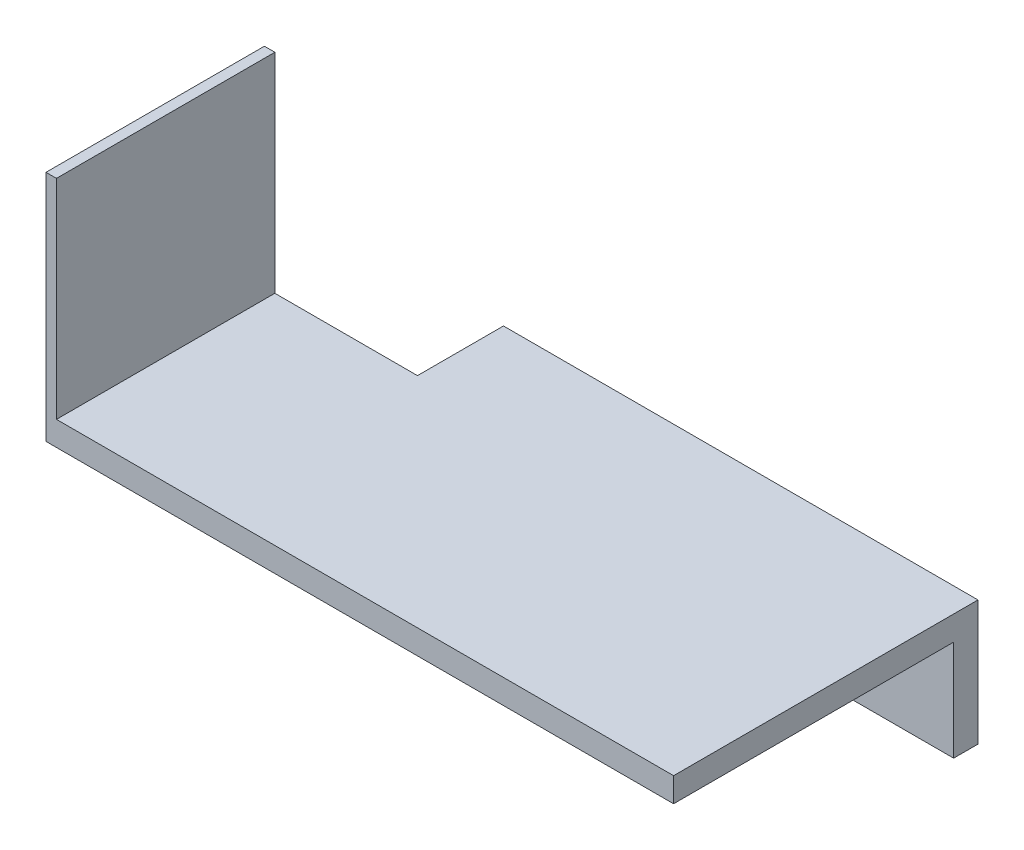
ISO-10303-21;
HEADER;
FILE_DESCRIPTION(('STEP AP214'),'2;1');
FILE_NAME('part.step','',(''),(''),'','','');
FILE_SCHEMA(('AUTOMOTIVE_DESIGN { 1 0 10303 214 1 1 1 1 }'));
ENDSEC;
DATA;
#1=APPLICATION_CONTEXT('core data for automotive mechanical design processes');
#2=APPLICATION_PROTOCOL_DEFINITION('international standard','automotive_design',2000,#1);
#3=PRODUCT_CONTEXT('',#1,'mechanical');
#4=PRODUCT('Part','Part','',(#3));
#5=PRODUCT_RELATED_PRODUCT_CATEGORY('part','',(#4));
#6=PRODUCT_DEFINITION_FORMATION('','',#4);
#7=PRODUCT_DEFINITION_CONTEXT('part definition',#1,'design');
#8=PRODUCT_DEFINITION('design','',#6,#7);
#9=PRODUCT_DEFINITION_SHAPE('','',#8);
#10=(LENGTH_UNIT() NAMED_UNIT(*) SI_UNIT(.MILLI.,.METRE.));
#11=(NAMED_UNIT(*) PLANE_ANGLE_UNIT() SI_UNIT($,.RADIAN.));
#12=(NAMED_UNIT(*) SI_UNIT($,.STERADIAN.) SOLID_ANGLE_UNIT());
#13=UNCERTAINTY_MEASURE_WITH_UNIT(LENGTH_MEASURE(1.E-05),#10,'distance_accuracy_value','');
#14=(GEOMETRIC_REPRESENTATION_CONTEXT(3) GLOBAL_UNCERTAINTY_ASSIGNED_CONTEXT((#13)) GLOBAL_UNIT_ASSIGNED_CONTEXT((#10,
#11,#12)) REPRESENTATION_CONTEXT('',''));
#15=CARTESIAN_POINT('',(0.,0.,0.));
#16=DIRECTION('',(0.,0.,1.));
#17=DIRECTION('',(1.,0.,0.));
#18=AXIS2_PLACEMENT_3D('',#15,#16,#17);
#19=CARTESIAN_POINT('',(34.1,8.975,3.5));
#20=DIRECTION('',(0.,-1.,0.));
#21=DIRECTION('',(0.,0.,-1.));
#22=AXIS2_PLACEMENT_3D('',#19,#20,#21);
#23=PLANE('',#22);
#24=DIRECTION('',(0.,0.,-1.));
#25=VECTOR('',#24,1.);
#26=CARTESIAN_POINT('',(-54.5965302079105,8.975,12.3613736549553));
#27=LINE('',#26,#25);
#28=CARTESIAN_POINT('',(-54.5965302079105,8.975,43.75));
#29=VERTEX_POINT('',#28);
#30=CARTESIAN_POINT('',(-54.5965302079105,8.975,12.3613736549553));
#31=VERTEX_POINT('',#30);
#32=EDGE_CURVE('E50',#29,#31,#27,.T.);
#33=ORIENTED_EDGE('',*,*,#32,.F.);
#34=DIRECTION('',(-1.,0.,0.));
#35=VECTOR('',#34,1.);
#36=CARTESIAN_POINT('',(34.1,8.975,43.75));
#37=LINE('',#36,#35);
#38=CARTESIAN_POINT('',(34.1,8.975,43.75));
#39=VERTEX_POINT('',#38);
#40=EDGE_CURVE('E158',#39,#29,#37,.T.);
#41=ORIENTED_EDGE('',*,*,#40,.F.);
#42=DIRECTION('',(0.,0.,-1.));
#43=VECTOR('',#42,1.);
#44=CARTESIAN_POINT('',(34.1,8.975,3.5));
#45=LINE('',#44,#43);
#46=CARTESIAN_POINT('',(34.1,8.975,0.));
#47=VERTEX_POINT('',#46);
#48=EDGE_CURVE('E194',#39,#47,#45,.T.);
#49=ORIENTED_EDGE('',*,*,#48,.T.);
#50=DIRECTION('',(-1.,0.,0.));
#51=VECTOR('',#50,1.);
#52=CARTESIAN_POINT('',(34.1,8.975,0.));
#53=LINE('',#52,#51);
#54=CARTESIAN_POINT('',(-34.1,8.975,0.));
#55=VERTEX_POINT('',#54);
#56=EDGE_CURVE('E180',#47,#55,#53,.T.);
#57=ORIENTED_EDGE('',*,*,#56,.T.);
#58=DIRECTION('',(0.,0.,-1.));
#59=VECTOR('',#58,1.);
#60=CARTESIAN_POINT('',(-34.1,8.975,3.5));
#61=LINE('',#60,#59);
#62=CARTESIAN_POINT('',(-34.1,8.975,12.3613736549553));
#63=VERTEX_POINT('',#62);
#64=EDGE_CURVE('E184',#63,#55,#61,.T.);
#65=ORIENTED_EDGE('',*,*,#64,.F.);
#66=DIRECTION('',(1.,0.,0.));
#67=VECTOR('',#66,1.);
#68=CARTESIAN_POINT('',(-56.1,8.975,12.3613736549553));
#69=LINE('',#68,#67);
#70=EDGE_CURVE('E57',#31,#63,#69,.T.);
#71=ORIENTED_EDGE('',*,*,#70,.F.);
#72=EDGE_LOOP('',(#33,#41,#49,#57,#65,#71));
#73=FACE_BOUND('',#72,.T.);
#74=ADVANCED_FACE('F35',(#73),#23,.F.);
#75=CARTESIAN_POINT('',(-34.1,-8.975,3.5));
#76=DIRECTION('',(1.,0.,0.));
#77=DIRECTION('',(0.,0.,-1.));
#78=AXIS2_PLACEMENT_3D('',#75,#76,#77);
#79=PLANE('',#78);
#80=DIRECTION('',(0.,-1.,0.));
#81=VECTOR('',#80,1.);
#82=CARTESIAN_POINT('',(-34.1,5.475,12.3613736549553));
#83=LINE('',#82,#81);
#84=CARTESIAN_POINT('',(-34.1,5.475,12.3613736549553));
#85=VERTEX_POINT('',#84);
#86=EDGE_CURVE('E147',#63,#85,#83,.T.);
#87=ORIENTED_EDGE('',*,*,#86,.F.);
#88=ORIENTED_EDGE('',*,*,#64,.T.);
#89=DIRECTION('',(0.,-1.,0.));
#90=VECTOR('',#89,1.);
#91=CARTESIAN_POINT('',(-34.1,-8.975,0.));
#92=LINE('',#91,#90);
#93=CARTESIAN_POINT('',(-34.1,-8.975,0.));
#94=VERTEX_POINT('',#93);
#95=EDGE_CURVE('E176',#55,#94,#92,.T.);
#96=ORIENTED_EDGE('',*,*,#95,.T.);
#97=DIRECTION('',(0.,0.,-1.));
#98=VECTOR('',#97,1.);
#99=CARTESIAN_POINT('',(-34.1,-8.975,3.5));
#100=LINE('',#99,#98);
#101=CARTESIAN_POINT('',(-34.1,-8.975,3.5));
#102=VERTEX_POINT('',#101);
#103=EDGE_CURVE('E11',#102,#94,#100,.T.);
#104=ORIENTED_EDGE('',*,*,#103,.F.);
#105=DIRECTION('',(0.,-1.,0.));
#106=VECTOR('',#105,1.);
#107=CARTESIAN_POINT('',(-34.1,-8.975,3.5));
#108=LINE('',#107,#106);
#109=CARTESIAN_POINT('',(-34.1,5.475,3.5));
#110=VERTEX_POINT('',#109);
#111=EDGE_CURVE('E177',#110,#102,#108,.T.);
#112=ORIENTED_EDGE('',*,*,#111,.F.);
#113=DIRECTION('',(0.,0.,-1.));
#114=VECTOR('',#113,1.);
#115=CARTESIAN_POINT('',(-34.1,5.475,31.75));
#116=LINE('',#115,#114);
#117=EDGE_CURVE('E174',#85,#110,#116,.T.);
#118=ORIENTED_EDGE('',*,*,#117,.F.);
#119=EDGE_LOOP('',(#87,#88,#96,#104,#112,#118));
#120=FACE_BOUND('',#119,.T.);
#121=ADVANCED_FACE('F37',(#120),#79,.F.);
#122=CARTESIAN_POINT('',(34.1,-8.975,3.5));
#123=DIRECTION('',(0.,1.,0.));
#124=DIRECTION('',(0.,0.,1.));
#125=AXIS2_PLACEMENT_3D('',#122,#123,#124);
#126=PLANE('',#125);
#127=DIRECTION('',(1.,0.,0.));
#128=VECTOR('',#127,1.);
#129=CARTESIAN_POINT('',(34.1,-8.975,0.));
#130=LINE('',#129,#128);
#131=CARTESIAN_POINT('',(34.1,-8.975,0.));
#132=VERTEX_POINT('',#131);
#133=EDGE_CURVE('E187',#94,#132,#130,.T.);
#134=ORIENTED_EDGE('',*,*,#133,.T.);
#135=DIRECTION('',(0.,0.,-1.));
#136=VECTOR('',#135,1.);
#137=CARTESIAN_POINT('',(34.1,-8.975,3.5));
#138=LINE('',#137,#136);
#139=CARTESIAN_POINT('',(34.1,-8.975,3.5));
#140=VERTEX_POINT('',#139);
#141=EDGE_CURVE('E43',#140,#132,#138,.T.);
#142=ORIENTED_EDGE('',*,*,#141,.F.);
#143=DIRECTION('',(1.,0.,0.));
#144=VECTOR('',#143,1.);
#145=CARTESIAN_POINT('',(34.1,-8.975,3.5));
#146=LINE('',#145,#144);
#147=EDGE_CURVE('E179',#102,#140,#146,.T.);
#148=ORIENTED_EDGE('',*,*,#147,.F.);
#149=ORIENTED_EDGE('',*,*,#103,.T.);
#150=EDGE_LOOP('',(#134,#142,#148,#149));
#151=FACE_BOUND('',#150,.T.);
#152=ADVANCED_FACE('F218',(#151),#126,.F.);
#153=CARTESIAN_POINT('',(34.1,-8.975,3.5));
#154=DIRECTION('',(-1.,0.,0.));
#155=DIRECTION('',(0.,0.,1.));
#156=AXIS2_PLACEMENT_3D('',#153,#154,#155);
#157=PLANE('',#156);
#158=DIRECTION('',(0.,1.,0.));
#159=VECTOR('',#158,1.);
#160=CARTESIAN_POINT('',(34.1,-8.975,0.));
#161=LINE('',#160,#159);
#162=EDGE_CURVE('E189',#132,#47,#161,.T.);
#163=ORIENTED_EDGE('',*,*,#162,.T.);
#164=ORIENTED_EDGE('',*,*,#48,.F.);
#165=DIRECTION('',(0.,1.,0.));
#166=VECTOR('',#165,1.);
#167=CARTESIAN_POINT('',(34.1,8.975,43.75));
#168=LINE('',#167,#166);
#169=CARTESIAN_POINT('',(34.1,5.475,43.75));
#170=VERTEX_POINT('',#169);
#171=EDGE_CURVE('E156',#170,#39,#168,.T.);
#172=ORIENTED_EDGE('',*,*,#171,.F.);
#173=DIRECTION('',(0.,0.,-1.));
#174=VECTOR('',#173,1.);
#175=CARTESIAN_POINT('',(34.1,5.475,31.75));
#176=LINE('',#175,#174);
#177=CARTESIAN_POINT('',(34.1,5.475,3.5));
#178=VERTEX_POINT('',#177);
#179=EDGE_CURVE('E171',#170,#178,#176,.T.);
#180=ORIENTED_EDGE('',*,*,#179,.T.);
#181=DIRECTION('',(0.,1.,0.));
#182=VECTOR('',#181,1.);
#183=CARTESIAN_POINT('',(34.1,-8.975,3.5));
#184=LINE('',#183,#182);
#185=EDGE_CURVE('E182',#140,#178,#184,.T.);
#186=ORIENTED_EDGE('',*,*,#185,.F.);
#187=ORIENTED_EDGE('',*,*,#141,.T.);
#188=EDGE_LOOP('',(#163,#164,#172,#180,#186,#187));
#189=FACE_BOUND('',#188,.T.);
#190=ADVANCED_FACE('F201',(#189),#157,.F.);
#191=CARTESIAN_POINT('',(0.,0.,3.5));
#192=DIRECTION('',(0.,0.,1.));
#193=DIRECTION('',(1.,0.,0.));
#194=AXIS2_PLACEMENT_3D('',#191,#192,#193);
#195=PLANE('',#194);
#196=CARTESIAN_POINT('',(0.,-3.07053348593506,3.5));
#197=DIRECTION('',(0.,0.,1.));
#198=DIRECTION('',(1.,0.,0.));
#199=AXIS2_PLACEMENT_3D('',#196,#197,#198);
#200=CIRCLE('',#199,2.85);
#201=CARTESIAN_POINT('',(2.85,-3.07053348593506,3.5));
#202=VERTEX_POINT('',#201);
#203=EDGE_CURVE('E165',#202,#202,#200,.T.);
#204=ORIENTED_EDGE('',*,*,#203,.F.);
#205=EDGE_LOOP('',(#204));
#206=FACE_BOUND('',#205,.T.);
#207=DIRECTION('',(1.,0.,0.));
#208=VECTOR('',#207,1.);
#209=CARTESIAN_POINT('',(-34.1,5.475,3.5));
#210=LINE('',#209,#208);
#211=EDGE_CURVE('E168',#110,#178,#210,.T.);
#212=ORIENTED_EDGE('',*,*,#211,.F.);
#213=ORIENTED_EDGE('',*,*,#111,.T.);
#214=ORIENTED_EDGE('',*,*,#147,.T.);
#215=ORIENTED_EDGE('',*,*,#185,.T.);
#216=EDGE_LOOP('',(#212,#213,#214,#215));
#217=FACE_BOUND('',#216,.T.);
#218=ADVANCED_FACE('F215',(#206,#217),#195,.T.);
#219=CARTESIAN_POINT('',(0.,0.,0.));
#220=DIRECTION('',(0.,0.,1.));
#221=DIRECTION('',(1.,0.,0.));
#222=AXIS2_PLACEMENT_3D('',#219,#220,#221);
#223=PLANE('',#222);
#224=CARTESIAN_POINT('',(0.,-3.07053348593506,0.));
#225=DIRECTION('',(0.,0.,-1.));
#226=DIRECTION('',(-1.,0.,0.));
#227=AXIS2_PLACEMENT_3D('',#224,#225,#226);
#228=CIRCLE('',#227,2.85);
#229=CARTESIAN_POINT('',(-2.85,-3.07053348593506,0.));
#230=VERTEX_POINT('',#229);
#231=EDGE_CURVE('E162',#230,#230,#228,.T.);
#232=ORIENTED_EDGE('',*,*,#231,.F.);
#233=EDGE_LOOP('',(#232));
#234=FACE_BOUND('',#233,.T.);
#235=ORIENTED_EDGE('',*,*,#95,.F.);
#236=ORIENTED_EDGE('',*,*,#56,.F.);
#237=ORIENTED_EDGE('',*,*,#162,.F.);
#238=ORIENTED_EDGE('',*,*,#133,.F.);
#239=EDGE_LOOP('',(#235,#236,#237,#238));
#240=FACE_BOUND('',#239,.T.);
#241=ADVANCED_FACE('F207',(#234,#240),#223,.F.);
#242=CARTESIAN_POINT('',(-34.1,5.475,31.75));
#243=DIRECTION('',(0.,1.,0.));
#244=DIRECTION('',(0.,0.,1.));
#245=AXIS2_PLACEMENT_3D('',#242,#243,#244);
#246=PLANE('',#245);
#247=ORIENTED_EDGE('',*,*,#211,.T.);
#248=ORIENTED_EDGE('',*,*,#179,.F.);
#249=DIRECTION('',(1.,0.,0.));
#250=VECTOR('',#249,1.);
#251=CARTESIAN_POINT('',(34.1,5.475,43.75));
#252=LINE('',#251,#250);
#253=CARTESIAN_POINT('',(-56.1,5.475,43.75));
#254=VERTEX_POINT('',#253);
#255=EDGE_CURVE('E160',#254,#170,#252,.T.);
#256=ORIENTED_EDGE('',*,*,#255,.F.);
#257=DIRECTION('',(0.,0.,1.));
#258=VECTOR('',#257,1.);
#259=CARTESIAN_POINT('',(-56.1,5.475,12.3613736549553));
#260=LINE('',#259,#258);
#261=CARTESIAN_POINT('',(-56.1,5.475,12.3613736549553));
#262=VERTEX_POINT('',#261);
#263=EDGE_CURVE('E121',#262,#254,#260,.T.);
#264=ORIENTED_EDGE('',*,*,#263,.F.);
#265=DIRECTION('',(1.,0.,0.));
#266=VECTOR('',#265,1.);
#267=CARTESIAN_POINT('',(-56.1,5.475,12.3613736549553));
#268=LINE('',#267,#266);
#269=EDGE_CURVE('E153',#262,#85,#268,.T.);
#270=ORIENTED_EDGE('',*,*,#269,.T.);
#271=ORIENTED_EDGE('',*,*,#117,.T.);
#272=EDGE_LOOP('',(#247,#248,#256,#264,#270,#271));
#273=FACE_BOUND('',#272,.T.);
#274=ADVANCED_FACE('F211',(#273),#246,.F.);
#275=CARTESIAN_POINT('',(0.,-3.07053348593506,28.25));
#276=DIRECTION('',(0.,0.,-1.));
#277=DIRECTION('',(-1.,0.,0.));
#278=AXIS2_PLACEMENT_3D('',#275,#276,#277);
#279=CYLINDRICAL_SURFACE('',#278,2.85);
#280=ORIENTED_EDGE('',*,*,#203,.T.);
#281=EDGE_LOOP('',(#280));
#282=FACE_BOUND('',#281,.T.);
#283=ORIENTED_EDGE('',*,*,#231,.T.);
#284=EDGE_LOOP('',(#283));
#285=FACE_BOUND('',#284,.T.);
#286=ADVANCED_FACE('F238',(#282,#285),#279,.F.);
#287=CARTESIAN_POINT('',(0.,0.,43.75));
#288=DIRECTION('',(0.,0.,-1.));
#289=DIRECTION('',(-1.,0.,0.));
#290=AXIS2_PLACEMENT_3D('',#287,#288,#289);
#291=PLANE('',#290);
#292=ORIENTED_EDGE('',*,*,#171,.T.);
#293=ORIENTED_EDGE('',*,*,#40,.T.);
#294=DIRECTION('',(0.,-1.,0.));
#295=VECTOR('',#294,1.);
#296=CARTESIAN_POINT('',(-54.5965302079105,38.975,43.75));
#297=LINE('',#296,#295);
#298=CARTESIAN_POINT('',(-54.5965302079105,38.975,43.75));
#299=VERTEX_POINT('',#298);
#300=EDGE_CURVE('E130',#299,#29,#297,.T.);
#301=ORIENTED_EDGE('',*,*,#300,.F.);
#302=DIRECTION('',(1.,0.,0.));
#303=VECTOR('',#302,1.);
#304=CARTESIAN_POINT('',(-56.1,38.975,43.75));
#305=LINE('',#304,#303);
#306=CARTESIAN_POINT('',(-56.1,38.975,43.75));
#307=VERTEX_POINT('',#306);
#308=EDGE_CURVE('E126',#307,#299,#305,.T.);
#309=ORIENTED_EDGE('',*,*,#308,.F.);
#310=DIRECTION('',(0.,1.,0.));
#311=VECTOR('',#310,1.);
#312=CARTESIAN_POINT('',(-56.1,5.475,43.75));
#313=LINE('',#312,#311);
#314=EDGE_CURVE('E115',#254,#307,#313,.T.);
#315=ORIENTED_EDGE('',*,*,#314,.F.);
#316=ORIENTED_EDGE('',*,*,#255,.T.);
#317=EDGE_LOOP('',(#292,#293,#301,#309,#315,#316));
#318=FACE_BOUND('',#317,.T.);
#319=ADVANCED_FACE('F128',(#318),#291,.F.);
#320=CARTESIAN_POINT('',(-56.1,5.475,12.3613736549553));
#321=DIRECTION('',(0.,0.,1.));
#322=DIRECTION('',(1.,0.,0.));
#323=AXIS2_PLACEMENT_3D('',#320,#321,#322);
#324=PLANE('',#323);
#325=ORIENTED_EDGE('',*,*,#86,.T.);
#326=ORIENTED_EDGE('',*,*,#269,.F.);
#327=DIRECTION('',(0.,-1.,0.));
#328=VECTOR('',#327,1.);
#329=CARTESIAN_POINT('',(-56.1,5.475,12.3613736549553));
#330=LINE('',#329,#328);
#331=CARTESIAN_POINT('',(-56.1,38.975,12.3613736549553));
#332=VERTEX_POINT('',#331);
#333=EDGE_CURVE('E148',#332,#262,#330,.T.);
#334=ORIENTED_EDGE('',*,*,#333,.F.);
#335=DIRECTION('',(-1.,0.,0.));
#336=VECTOR('',#335,1.);
#337=CARTESIAN_POINT('',(-56.1,38.975,12.3613736549553));
#338=LINE('',#337,#336);
#339=CARTESIAN_POINT('',(-54.5965302079105,38.975,12.3613736549553));
#340=VERTEX_POINT('',#339);
#341=EDGE_CURVE('E138',#340,#332,#338,.T.);
#342=ORIENTED_EDGE('',*,*,#341,.F.);
#343=DIRECTION('',(0.,-1.,0.));
#344=VECTOR('',#343,1.);
#345=CARTESIAN_POINT('',(-54.5965302079105,38.975,12.3613736549553));
#346=LINE('',#345,#344);
#347=EDGE_CURVE('E143',#340,#31,#346,.T.);
#348=ORIENTED_EDGE('',*,*,#347,.T.);
#349=ORIENTED_EDGE('',*,*,#70,.T.);
#350=EDGE_LOOP('',(#325,#326,#334,#342,#348,#349));
#351=FACE_BOUND('',#350,.T.);
#352=ADVANCED_FACE('F244',(#351),#324,.F.);
#353=CARTESIAN_POINT('',(-56.1,0.,0.));
#354=DIRECTION('',(1.,0.,0.));
#355=DIRECTION('',(0.,0.,-1.));
#356=AXIS2_PLACEMENT_3D('',#353,#354,#355);
#357=PLANE('',#356);
#358=ORIENTED_EDGE('',*,*,#333,.T.);
#359=ORIENTED_EDGE('',*,*,#263,.T.);
#360=ORIENTED_EDGE('',*,*,#314,.T.);
#361=DIRECTION('',(0.,0.,1.));
#362=VECTOR('',#361,1.);
#363=CARTESIAN_POINT('',(-56.1,38.975,12.3613736549553));
#364=LINE('',#363,#362);
#365=EDGE_CURVE('E120',#332,#307,#364,.T.);
#366=ORIENTED_EDGE('',*,*,#365,.F.);
#367=EDGE_LOOP('',(#358,#359,#360,#366));
#368=FACE_BOUND('',#367,.T.);
#369=ADVANCED_FACE('F118',(#368),#357,.F.);
#370=CARTESIAN_POINT('',(-54.5965302079105,38.975,12.3613736549553));
#371=DIRECTION('',(-1.,0.,0.));
#372=DIRECTION('',(0.,0.,1.));
#373=AXIS2_PLACEMENT_3D('',#370,#371,#372);
#374=PLANE('',#373);
#375=ORIENTED_EDGE('',*,*,#32,.T.);
#376=ORIENTED_EDGE('',*,*,#347,.F.);
#377=DIRECTION('',(0.,0.,-1.));
#378=VECTOR('',#377,1.);
#379=CARTESIAN_POINT('',(-54.5965302079105,38.975,12.3613736549553));
#380=LINE('',#379,#378);
#381=EDGE_CURVE('E133',#299,#340,#380,.T.);
#382=ORIENTED_EDGE('',*,*,#381,.F.);
#383=ORIENTED_EDGE('',*,*,#300,.T.);
#384=EDGE_LOOP('',(#375,#376,#382,#383));
#385=FACE_BOUND('',#384,.T.);
#386=ADVANCED_FACE('F249',(#385),#374,.F.);
#387=CARTESIAN_POINT('',(0.,38.975,0.));
#388=DIRECTION('',(0.,1.,0.));
#389=DIRECTION('',(0.,0.,1.));
#390=AXIS2_PLACEMENT_3D('',#387,#388,#389);
#391=PLANE('',#390);
#392=ORIENTED_EDGE('',*,*,#365,.T.);
#393=ORIENTED_EDGE('',*,*,#308,.T.);
#394=ORIENTED_EDGE('',*,*,#381,.T.);
#395=ORIENTED_EDGE('',*,*,#341,.T.);
#396=EDGE_LOOP('',(#392,#393,#394,#395));
#397=FACE_BOUND('',#396,.T.);
#398=ADVANCED_FACE('F136',(#397),#391,.T.);
#399=CLOSED_SHELL('',(#74,#121,#152,#190,#218,#241,#274,#286,#319,#352,#369,#386,#398));
#400=MANIFOLD_SOLID_BREP('B2',#399);
#401=ADVANCED_BREP_SHAPE_REPRESENTATION('',(#18,#400),#14);
#402=SHAPE_DEFINITION_REPRESENTATION(#9,#401);
ENDSEC;
END-ISO-10303-21;
